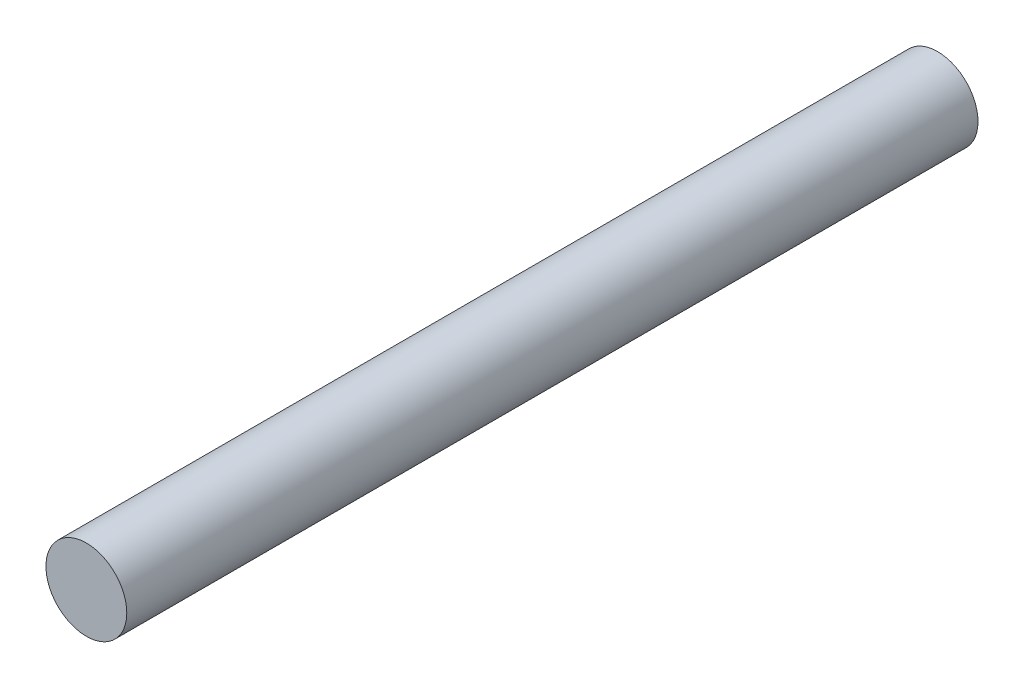
ISO-10303-21;
HEADER;
FILE_DESCRIPTION(('STEP AP214'),'2;1');
FILE_NAME('part.step','',(''),(''),'','','');
FILE_SCHEMA(('AUTOMOTIVE_DESIGN { 1 0 10303 214 1 1 1 1 }'));
ENDSEC;
DATA;
#1=APPLICATION_CONTEXT('core data for automotive mechanical design processes');
#2=APPLICATION_PROTOCOL_DEFINITION('international standard','automotive_design',2000,#1);
#3=PRODUCT_CONTEXT('',#1,'mechanical');
#4=PRODUCT('Part','Part','',(#3));
#5=PRODUCT_RELATED_PRODUCT_CATEGORY('part','',(#4));
#6=PRODUCT_DEFINITION_FORMATION('','',#4);
#7=PRODUCT_DEFINITION_CONTEXT('part definition',#1,'design');
#8=PRODUCT_DEFINITION('design','',#6,#7);
#9=PRODUCT_DEFINITION_SHAPE('','',#8);
#10=(LENGTH_UNIT() NAMED_UNIT(*) SI_UNIT(.MILLI.,.METRE.));
#11=(NAMED_UNIT(*) PLANE_ANGLE_UNIT() SI_UNIT($,.RADIAN.));
#12=(NAMED_UNIT(*) SI_UNIT($,.STERADIAN.) SOLID_ANGLE_UNIT());
#13=UNCERTAINTY_MEASURE_WITH_UNIT(LENGTH_MEASURE(1.E-05),#10,'distance_accuracy_value','');
#14=(GEOMETRIC_REPRESENTATION_CONTEXT(3) GLOBAL_UNCERTAINTY_ASSIGNED_CONTEXT((#13)) GLOBAL_UNIT_ASSIGNED_CONTEXT((#10,
#11,#12)) REPRESENTATION_CONTEXT('',''));
#15=CARTESIAN_POINT('',(0.,0.,0.));
#16=DIRECTION('',(0.,0.,1.));
#17=DIRECTION('',(1.,0.,0.));
#18=AXIS2_PLACEMENT_3D('',#15,#16,#17);
#19=CARTESIAN_POINT('',(0.,0.,100.));
#20=DIRECTION('',(0.,0.,-1.));
#21=DIRECTION('',(-1.,0.,0.));
#22=AXIS2_PLACEMENT_3D('',#19,#20,#21);
#23=CYLINDRICAL_SURFACE('',#22,4.75);
#24=CARTESIAN_POINT('',(0.,0.,100.));
#25=DIRECTION('',(0.,0.,1.));
#26=DIRECTION('',(1.,0.,0.));
#27=AXIS2_PLACEMENT_3D('',#24,#25,#26);
#28=CIRCLE('',#27,4.75);
#29=CARTESIAN_POINT('',(4.75,0.,100.));
#30=VERTEX_POINT('',#29);
#31=EDGE_CURVE('E10',#30,#30,#28,.T.);
#32=ORIENTED_EDGE('',*,*,#31,.F.);
#33=EDGE_LOOP('',(#32));
#34=FACE_BOUND('',#33,.T.);
#35=CARTESIAN_POINT('',(0.,0.,0.));
#36=DIRECTION('',(0.,0.,1.));
#37=DIRECTION('',(1.,0.,0.));
#38=AXIS2_PLACEMENT_3D('',#35,#36,#37);
#39=CIRCLE('',#38,4.75);
#40=CARTESIAN_POINT('',(4.75,0.,0.));
#41=VERTEX_POINT('',#40);
#42=EDGE_CURVE('E42',#41,#41,#39,.T.);
#43=ORIENTED_EDGE('',*,*,#42,.T.);
#44=EDGE_LOOP('',(#43));
#45=FACE_BOUND('',#44,.T.);
#46=ADVANCED_FACE('F39',(#34,#45),#23,.T.);
#47=CARTESIAN_POINT('',(0.,0.,100.));
#48=DIRECTION('',(0.,0.,1.));
#49=DIRECTION('',(1.,0.,0.));
#50=AXIS2_PLACEMENT_3D('',#47,#48,#49);
#51=PLANE('',#50);
#52=ORIENTED_EDGE('',*,*,#31,.T.);
#53=EDGE_LOOP('',(#52));
#54=FACE_BOUND('',#53,.T.);
#55=ADVANCED_FACE('F56',(#54),#51,.T.);
#56=CARTESIAN_POINT('',(0.,0.,0.));
#57=DIRECTION('',(0.,0.,1.));
#58=DIRECTION('',(1.,0.,0.));
#59=AXIS2_PLACEMENT_3D('',#56,#57,#58);
#60=PLANE('',#59);
#61=ORIENTED_EDGE('',*,*,#42,.F.);
#62=EDGE_LOOP('',(#61));
#63=FACE_BOUND('',#62,.T.);
#64=ADVANCED_FACE('F54',(#63),#60,.F.);
#65=CLOSED_SHELL('',(#46,#55,#64));
#66=MANIFOLD_SOLID_BREP('B2',#65);
#67=ADVANCED_BREP_SHAPE_REPRESENTATION('',(#18,#66),#14);
#68=SHAPE_DEFINITION_REPRESENTATION(#9,#67);
ENDSEC;
END-ISO-10303-21;
